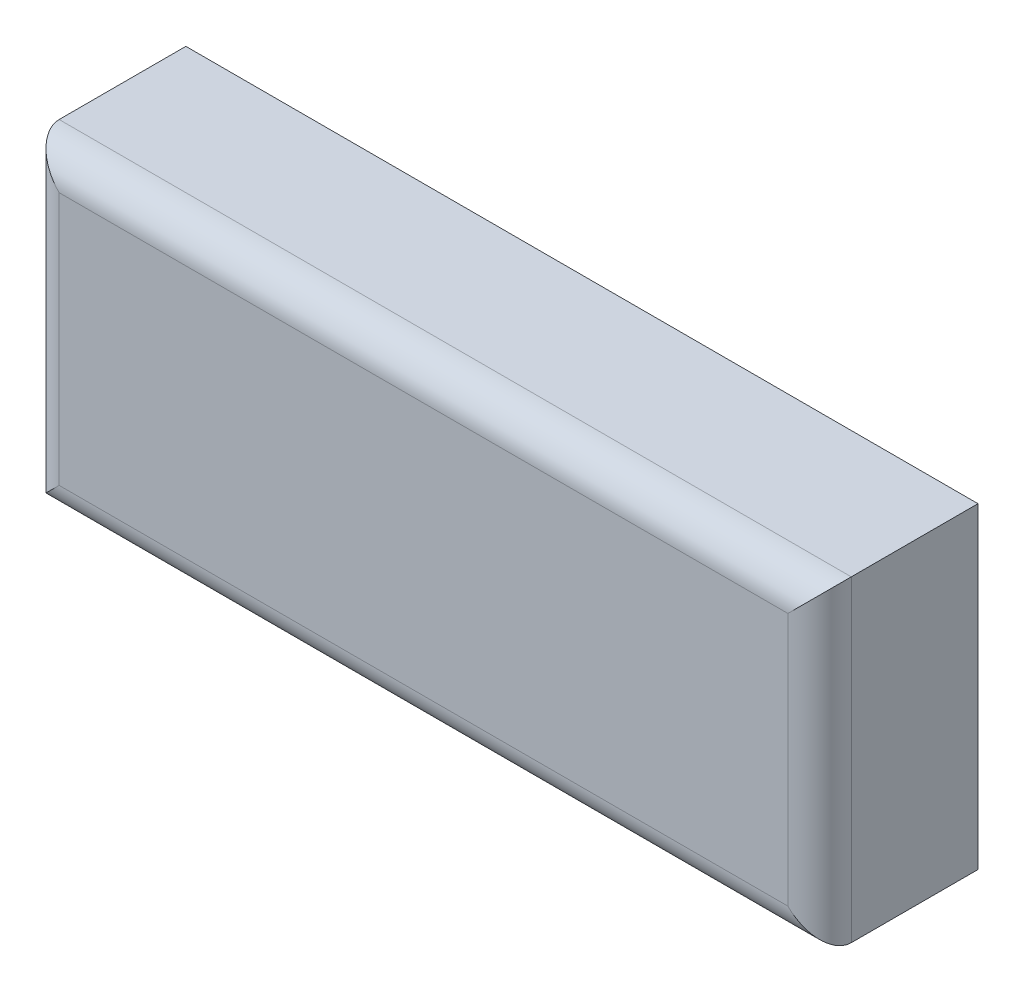
ISO-10303-21;
HEADER;
FILE_DESCRIPTION(('STEP AP214'),'2;1');
FILE_NAME('part.step','',(''),(''),'','','');
FILE_SCHEMA(('AUTOMOTIVE_DESIGN { 1 0 10303 214 1 1 1 1 }'));
ENDSEC;
DATA;
#1=APPLICATION_CONTEXT('core data for automotive mechanical design processes');
#2=APPLICATION_PROTOCOL_DEFINITION('international standard','automotive_design',2000,#1);
#3=PRODUCT_CONTEXT('',#1,'mechanical');
#4=PRODUCT('Part','Part','',(#3));
#5=PRODUCT_RELATED_PRODUCT_CATEGORY('part','',(#4));
#6=PRODUCT_DEFINITION_FORMATION('','',#4);
#7=PRODUCT_DEFINITION_CONTEXT('part definition',#1,'design');
#8=PRODUCT_DEFINITION('design','',#6,#7);
#9=PRODUCT_DEFINITION_SHAPE('','',#8);
#10=(LENGTH_UNIT() NAMED_UNIT(*) SI_UNIT(.MILLI.,.METRE.));
#11=(NAMED_UNIT(*) PLANE_ANGLE_UNIT() SI_UNIT($,.RADIAN.));
#12=(NAMED_UNIT(*) SI_UNIT($,.STERADIAN.) SOLID_ANGLE_UNIT());
#13=UNCERTAINTY_MEASURE_WITH_UNIT(LENGTH_MEASURE(1.E-05),#10,'distance_accuracy_value','');
#14=(GEOMETRIC_REPRESENTATION_CONTEXT(3) GLOBAL_UNCERTAINTY_ASSIGNED_CONTEXT((#13)) GLOBAL_UNIT_ASSIGNED_CONTEXT((#10,
#11,#12)) REPRESENTATION_CONTEXT('',''));
#15=CARTESIAN_POINT('',(0.,0.,0.));
#16=DIRECTION('',(0.,0.,1.));
#17=DIRECTION('',(1.,0.,0.));
#18=AXIS2_PLACEMENT_3D('',#15,#16,#17);
#19=CARTESIAN_POINT('',(-35.9731543624161,15.6428412640808,10.));
#20=DIRECTION('',(1.,0.,0.));
#21=DIRECTION('',(0.,0.,-1.));
#22=AXIS2_PLACEMENT_3D('',#19,#20,#21);
#23=PLANE('',#22);
#24=DIRECTION('',(0.,0.,-1.));
#25=VECTOR('',#24,1.);
#26=CARTESIAN_POINT('',(-35.9731543624161,-4.35715873591925,10.));
#27=LINE('',#26,#25);
#28=CARTESIAN_POINT('',(-35.9731543624161,-4.35715873591925,8.));
#29=VERTEX_POINT('',#28);
#30=CARTESIAN_POINT('',(-35.9731543624161,-4.35715873591925,0.));
#31=VERTEX_POINT('',#30);
#32=EDGE_CURVE('E87',#29,#31,#27,.T.);
#33=ORIENTED_EDGE('',*,*,#32,.F.);
#34=DIRECTION('',(0.,-1.,0.));
#35=VECTOR('',#34,1.);
#36=CARTESIAN_POINT('',(-35.9731543624161,15.6428412640808,8.));
#37=LINE('',#36,#35);
#38=CARTESIAN_POINT('',(-35.9731543624161,15.6428412640808,8.));
#39=VERTEX_POINT('',#38);
#40=EDGE_CURVE('E11',#29,#39,#37,.F.);
#41=ORIENTED_EDGE('',*,*,#40,.T.);
#42=DIRECTION('',(0.,0.,-1.));
#43=VECTOR('',#42,1.);
#44=CARTESIAN_POINT('',(-35.9731543624161,15.6428412640808,10.));
#45=LINE('',#44,#43);
#46=CARTESIAN_POINT('',(-35.9731543624161,15.6428412640808,0.));
#47=VERTEX_POINT('',#46);
#48=EDGE_CURVE('E107',#39,#47,#45,.T.);
#49=ORIENTED_EDGE('',*,*,#48,.T.);
#50=DIRECTION('',(0.,-1.,0.));
#51=VECTOR('',#50,1.);
#52=CARTESIAN_POINT('',(-35.9731543624161,15.6428412640808,0.));
#53=LINE('',#52,#51);
#54=EDGE_CURVE('E102',#47,#31,#53,.T.);
#55=ORIENTED_EDGE('',*,*,#54,.T.);
#56=EDGE_LOOP('',(#33,#41,#49,#55));
#57=FACE_BOUND('',#56,.T.);
#58=ADVANCED_FACE('F35',(#57),#23,.F.);
#59=CARTESIAN_POINT('',(-35.9731543624161,-4.35715873591925,10.));
#60=DIRECTION('',(0.,1.,0.));
#61=DIRECTION('',(-1.,0.,0.));
#62=AXIS2_PLACEMENT_3D('',#59,#60,#61);
#63=PLANE('',#62);
#64=DIRECTION('',(0.,0.,-1.));
#65=VECTOR('',#64,1.);
#66=CARTESIAN_POINT('',(14.0268456375839,-4.35715873591925,10.));
#67=LINE('',#66,#65);
#68=CARTESIAN_POINT('',(14.0268456375839,-4.35715873591925,8.));
#69=VERTEX_POINT('',#68);
#70=CARTESIAN_POINT('',(14.0268456375839,-4.35715873591925,0.));
#71=VERTEX_POINT('',#70);
#72=EDGE_CURVE('E96',#69,#71,#67,.T.);
#73=ORIENTED_EDGE('',*,*,#72,.F.);
#74=DIRECTION('',(1.,0.,0.));
#75=VECTOR('',#74,1.);
#76=CARTESIAN_POINT('',(-35.9731543624161,-4.35715873591925,8.));
#77=LINE('',#76,#75);
#78=EDGE_CURVE('E44',#69,#29,#77,.F.);
#79=ORIENTED_EDGE('',*,*,#78,.T.);
#80=ORIENTED_EDGE('',*,*,#32,.T.);
#81=DIRECTION('',(1.,0.,0.));
#82=VECTOR('',#81,1.);
#83=CARTESIAN_POINT('',(-35.9731543624161,-4.35715873591925,0.));
#84=LINE('',#83,#82);
#85=EDGE_CURVE('E90',#31,#71,#84,.T.);
#86=ORIENTED_EDGE('',*,*,#85,.T.);
#87=EDGE_LOOP('',(#73,#79,#80,#86));
#88=FACE_BOUND('',#87,.T.);
#89=ADVANCED_FACE('F89',(#88),#63,.F.);
#90=CARTESIAN_POINT('',(14.0268456375839,15.6428412640808,10.));
#91=DIRECTION('',(-1.,0.,0.));
#92=DIRECTION('',(0.,0.,1.));
#93=AXIS2_PLACEMENT_3D('',#90,#91,#92);
#94=PLANE('',#93);
#95=DIRECTION('',(0.,0.,-1.));
#96=VECTOR('',#95,1.);
#97=CARTESIAN_POINT('',(14.0268456375839,15.6428412640808,10.));
#98=LINE('',#97,#96);
#99=CARTESIAN_POINT('',(14.0268456375839,15.6428412640808,8.));
#100=VERTEX_POINT('',#99);
#101=CARTESIAN_POINT('',(14.0268456375839,15.6428412640808,0.));
#102=VERTEX_POINT('',#101);
#103=EDGE_CURVE('E120',#100,#102,#98,.T.);
#104=ORIENTED_EDGE('',*,*,#103,.F.);
#105=DIRECTION('',(0.,1.,0.));
#106=VECTOR('',#105,1.);
#107=CARTESIAN_POINT('',(14.0268456375839,-4.35715873591925,8.));
#108=LINE('',#107,#106);
#109=EDGE_CURVE('E59',#100,#69,#108,.F.);
#110=ORIENTED_EDGE('',*,*,#109,.T.);
#111=ORIENTED_EDGE('',*,*,#72,.T.);
#112=DIRECTION('',(0.,1.,0.));
#113=VECTOR('',#112,1.);
#114=CARTESIAN_POINT('',(14.0268456375839,15.6428412640808,0.));
#115=LINE('',#114,#113);
#116=EDGE_CURVE('E104',#71,#102,#115,.T.);
#117=ORIENTED_EDGE('',*,*,#116,.T.);
#118=EDGE_LOOP('',(#104,#110,#111,#117));
#119=FACE_BOUND('',#118,.T.);
#120=ADVANCED_FACE('F159',(#119),#94,.F.);
#121=CARTESIAN_POINT('',(-35.9731543624161,15.6428412640808,10.));
#122=DIRECTION('',(0.,-1.,0.));
#123=DIRECTION('',(0.,0.,-1.));
#124=AXIS2_PLACEMENT_3D('',#121,#122,#123);
#125=PLANE('',#124);
#126=ORIENTED_EDGE('',*,*,#48,.F.);
#127=DIRECTION('',(-1.,0.,0.));
#128=VECTOR('',#127,1.);
#129=CARTESIAN_POINT('',(14.0268456375839,15.6428412640808,8.));
#130=LINE('',#129,#128);
#131=EDGE_CURVE('E131',#39,#100,#130,.F.);
#132=ORIENTED_EDGE('',*,*,#131,.T.);
#133=ORIENTED_EDGE('',*,*,#103,.T.);
#134=DIRECTION('',(-1.,0.,0.));
#135=VECTOR('',#134,1.);
#136=CARTESIAN_POINT('',(-35.9731543624161,15.6428412640808,0.));
#137=LINE('',#136,#135);
#138=EDGE_CURVE('E117',#102,#47,#137,.T.);
#139=ORIENTED_EDGE('',*,*,#138,.T.);
#140=EDGE_LOOP('',(#126,#132,#133,#139));
#141=FACE_BOUND('',#140,.T.);
#142=ADVANCED_FACE('F158',(#141),#125,.F.);
#143=CARTESIAN_POINT('',(0.,0.,10.));
#144=DIRECTION('',(0.,0.,1.));
#145=DIRECTION('',(1.,0.,0.));
#146=AXIS2_PLACEMENT_3D('',#143,#144,#145);
#147=PLANE('',#146);
#148=DIRECTION('',(0.,1.,0.));
#149=VECTOR('',#148,1.);
#150=CARTESIAN_POINT('',(12.0268456375839,15.6428412640808,10.));
#151=LINE('',#150,#149);
#152=CARTESIAN_POINT('',(12.0268456375839,-2.35715873591925,10.));
#153=VERTEX_POINT('',#152);
#154=CARTESIAN_POINT('',(12.0268456375839,13.6428412640808,10.));
#155=VERTEX_POINT('',#154);
#156=EDGE_CURVE('E126',#153,#155,#151,.T.);
#157=ORIENTED_EDGE('',*,*,#156,.T.);
#158=DIRECTION('',(-1.,0.,0.));
#159=VECTOR('',#158,1.);
#160=CARTESIAN_POINT('',(-35.9731543624161,13.6428412640808,10.));
#161=LINE('',#160,#159);
#162=CARTESIAN_POINT('',(-33.9731543624161,13.6428412640808,10.));
#163=VERTEX_POINT('',#162);
#164=EDGE_CURVE('E128',#155,#163,#161,.T.);
#165=ORIENTED_EDGE('',*,*,#164,.T.);
#166=DIRECTION('',(0.,-1.,0.));
#167=VECTOR('',#166,1.);
#168=CARTESIAN_POINT('',(-33.9731543624161,-4.35715873591925,10.));
#169=LINE('',#168,#167);
#170=CARTESIAN_POINT('',(-33.9731543624161,-2.35715873591925,10.));
#171=VERTEX_POINT('',#170);
#172=EDGE_CURVE('E95',#163,#171,#169,.T.);
#173=ORIENTED_EDGE('',*,*,#172,.T.);
#174=DIRECTION('',(1.,0.,0.));
#175=VECTOR('',#174,1.);
#176=CARTESIAN_POINT('',(14.0268456375839,-2.35715873591925,10.));
#177=LINE('',#176,#175);
#178=EDGE_CURVE('E124',#171,#153,#177,.T.);
#179=ORIENTED_EDGE('',*,*,#178,.T.);
#180=EDGE_LOOP('',(#157,#165,#173,#179));
#181=FACE_BOUND('',#180,.T.);
#182=ADVANCED_FACE('F151',(#181),#147,.T.);
#183=CARTESIAN_POINT('',(0.,0.,0.));
#184=DIRECTION('',(0.,0.,1.));
#185=DIRECTION('',(1.,0.,0.));
#186=AXIS2_PLACEMENT_3D('',#183,#184,#185);
#187=PLANE('',#186);
#188=CARTESIAN_POINT('',(-10.9731543624161,5.64284126408075,0.));
#189=DIRECTION('',(0.,0.,-1.));
#190=DIRECTION('',(-1.,0.,0.));
#191=AXIS2_PLACEMENT_3D('',#188,#189,#190);
#192=CIRCLE('',#191,4.);
#193=CARTESIAN_POINT('',(-14.9731543624161,5.64284126408075,0.));
#194=VERTEX_POINT('',#193);
#195=EDGE_CURVE('E113',#194,#194,#192,.T.);
#196=ORIENTED_EDGE('',*,*,#195,.F.);
#197=EDGE_LOOP('',(#196));
#198=FACE_BOUND('',#197,.T.);
#199=ORIENTED_EDGE('',*,*,#54,.F.);
#200=ORIENTED_EDGE('',*,*,#138,.F.);
#201=ORIENTED_EDGE('',*,*,#116,.F.);
#202=ORIENTED_EDGE('',*,*,#85,.F.);
#203=EDGE_LOOP('',(#199,#200,#201,#202));
#204=FACE_BOUND('',#203,.T.);
#205=ADVANCED_FACE('F100',(#198,#204),#187,.F.);
#206=CARTESIAN_POINT('',(0.,-2.35715873591925,8.));
#207=DIRECTION('',(-1.,0.,0.));
#208=DIRECTION('',(0.,-1.,0.));
#209=AXIS2_PLACEMENT_3D('',#206,#207,#208);
#210=CYLINDRICAL_SURFACE('',#209,2.);
#211=CARTESIAN_POINT('',(-33.9731543624161,-2.35715873591925,8.));
#212=DIRECTION('',(-0.707106781186547,0.707106781186547,0.));
#213=DIRECTION('',(0.707106781186547,0.707106781186547,0.));
#214=AXIS2_PLACEMENT_3D('',#211,#212,#213);
#215=ELLIPSE('',#214,2.82842712474619,2.);
#216=EDGE_CURVE('E111',#29,#171,#215,.T.);
#217=ORIENTED_EDGE('',*,*,#216,.F.);
#218=ORIENTED_EDGE('',*,*,#78,.F.);
#219=CARTESIAN_POINT('',(12.0268456375839,-2.35715873591925,8.));
#220=DIRECTION('',(-0.707106781186547,-0.707106781186547,0.));
#221=DIRECTION('',(-0.707106781186547,0.707106781186547,0.));
#222=AXIS2_PLACEMENT_3D('',#219,#220,#221);
#223=ELLIPSE('',#222,2.82842712474619,2.);
#224=EDGE_CURVE('E39',#153,#69,#223,.F.);
#225=ORIENTED_EDGE('',*,*,#224,.F.);
#226=ORIENTED_EDGE('',*,*,#178,.F.);
#227=EDGE_LOOP('',(#217,#218,#225,#226));
#228=FACE_BOUND('',#227,.T.);
#229=ADVANCED_FACE('F37',(#228),#210,.T.);
#230=CARTESIAN_POINT('',(12.0268456375839,0.,8.));
#231=DIRECTION('',(0.,-1.,0.));
#232=DIRECTION('',(0.,0.,-1.));
#233=AXIS2_PLACEMENT_3D('',#230,#231,#232);
#234=CYLINDRICAL_SURFACE('',#233,2.);
#235=ORIENTED_EDGE('',*,*,#224,.T.);
#236=ORIENTED_EDGE('',*,*,#109,.F.);
#237=CARTESIAN_POINT('',(12.0268456375839,13.6428412640808,8.));
#238=DIRECTION('',(0.707106781186547,-0.707106781186547,0.));
#239=DIRECTION('',(-0.707106781186547,-0.707106781186547,0.));
#240=AXIS2_PLACEMENT_3D('',#237,#238,#239);
#241=ELLIPSE('',#240,2.82842712474619,2.);
#242=EDGE_CURVE('E138',#155,#100,#241,.F.);
#243=ORIENTED_EDGE('',*,*,#242,.F.);
#244=ORIENTED_EDGE('',*,*,#156,.F.);
#245=EDGE_LOOP('',(#235,#236,#243,#244));
#246=FACE_BOUND('',#245,.T.);
#247=ADVANCED_FACE('F177',(#246),#234,.T.);
#248=CARTESIAN_POINT('',(-33.9731543624161,0.,8.));
#249=DIRECTION('',(0.,1.,0.));
#250=DIRECTION('',(0.,0.,1.));
#251=AXIS2_PLACEMENT_3D('',#248,#249,#250);
#252=CYLINDRICAL_SURFACE('',#251,2.);
#253=ORIENTED_EDGE('',*,*,#216,.T.);
#254=ORIENTED_EDGE('',*,*,#172,.F.);
#255=CARTESIAN_POINT('',(-33.9731543624161,13.6428412640808,8.));
#256=DIRECTION('',(0.707106781186547,0.707106781186547,0.));
#257=DIRECTION('',(-0.707106781186547,0.707106781186547,0.));
#258=AXIS2_PLACEMENT_3D('',#255,#256,#257);
#259=ELLIPSE('',#258,2.82842712474619,2.);
#260=EDGE_CURVE('E136',#39,#163,#259,.T.);
#261=ORIENTED_EDGE('',*,*,#260,.F.);
#262=ORIENTED_EDGE('',*,*,#40,.F.);
#263=EDGE_LOOP('',(#253,#254,#261,#262));
#264=FACE_BOUND('',#263,.T.);
#265=ADVANCED_FACE('F144',(#264),#252,.T.);
#266=CARTESIAN_POINT('',(0.,13.6428412640808,8.));
#267=DIRECTION('',(1.,0.,0.));
#268=DIRECTION('',(0.,0.,-1.));
#269=AXIS2_PLACEMENT_3D('',#266,#267,#268);
#270=CYLINDRICAL_SURFACE('',#269,2.);
#271=ORIENTED_EDGE('',*,*,#242,.T.);
#272=ORIENTED_EDGE('',*,*,#131,.F.);
#273=ORIENTED_EDGE('',*,*,#260,.T.);
#274=ORIENTED_EDGE('',*,*,#164,.F.);
#275=EDGE_LOOP('',(#271,#272,#273,#274));
#276=FACE_BOUND('',#275,.T.);
#277=ADVANCED_FACE('F155',(#276),#270,.T.);
#278=CARTESIAN_POINT('',(-10.9731543624161,5.64284126408075,5.));
#279=DIRECTION('',(0.,0.,-1.));
#280=DIRECTION('',(-1.,0.,0.));
#281=AXIS2_PLACEMENT_3D('',#278,#279,#280);
#282=CYLINDRICAL_SURFACE('',#281,4.);
#283=CARTESIAN_POINT('',(-10.9731543624161,5.64284126408075,5.));
#284=DIRECTION('',(0.,0.,-1.));
#285=DIRECTION('',(-1.,0.,0.));
#286=AXIS2_PLACEMENT_3D('',#283,#284,#285);
#287=CIRCLE('',#286,4.);
#288=CARTESIAN_POINT('',(-14.9731543624161,5.64284126408075,5.));
#289=VERTEX_POINT('',#288);
#290=EDGE_CURVE('E139',#289,#289,#287,.T.);
#291=ORIENTED_EDGE('',*,*,#290,.F.);
#292=EDGE_LOOP('',(#291));
#293=FACE_BOUND('',#292,.T.);
#294=ORIENTED_EDGE('',*,*,#195,.T.);
#295=EDGE_LOOP('',(#294));
#296=FACE_BOUND('',#295,.T.);
#297=ADVANCED_FACE('F175',(#293,#296),#282,.F.);
#298=CARTESIAN_POINT('',(-10.9731543624161,5.64284126408075,5.));
#299=DIRECTION('',(0.,0.,-1.));
#300=DIRECTION('',(-1.,0.,0.));
#301=AXIS2_PLACEMENT_3D('',#298,#299,#300);
#302=PLANE('',#301);
#303=ORIENTED_EDGE('',*,*,#290,.T.);
#304=EDGE_LOOP('',(#303));
#305=FACE_BOUND('',#304,.T.);
#306=ADVANCED_FACE('F196',(#305),#302,.T.);
#307=CLOSED_SHELL('',(#58,#89,#120,#142,#182,#205,#229,#247,#265,#277,#297,#306));
#308=MANIFOLD_SOLID_BREP('B2',#307);
#309=ADVANCED_BREP_SHAPE_REPRESENTATION('',(#18,#308),#14);
#310=SHAPE_DEFINITION_REPRESENTATION(#9,#309);
ENDSEC;
END-ISO-10303-21;
